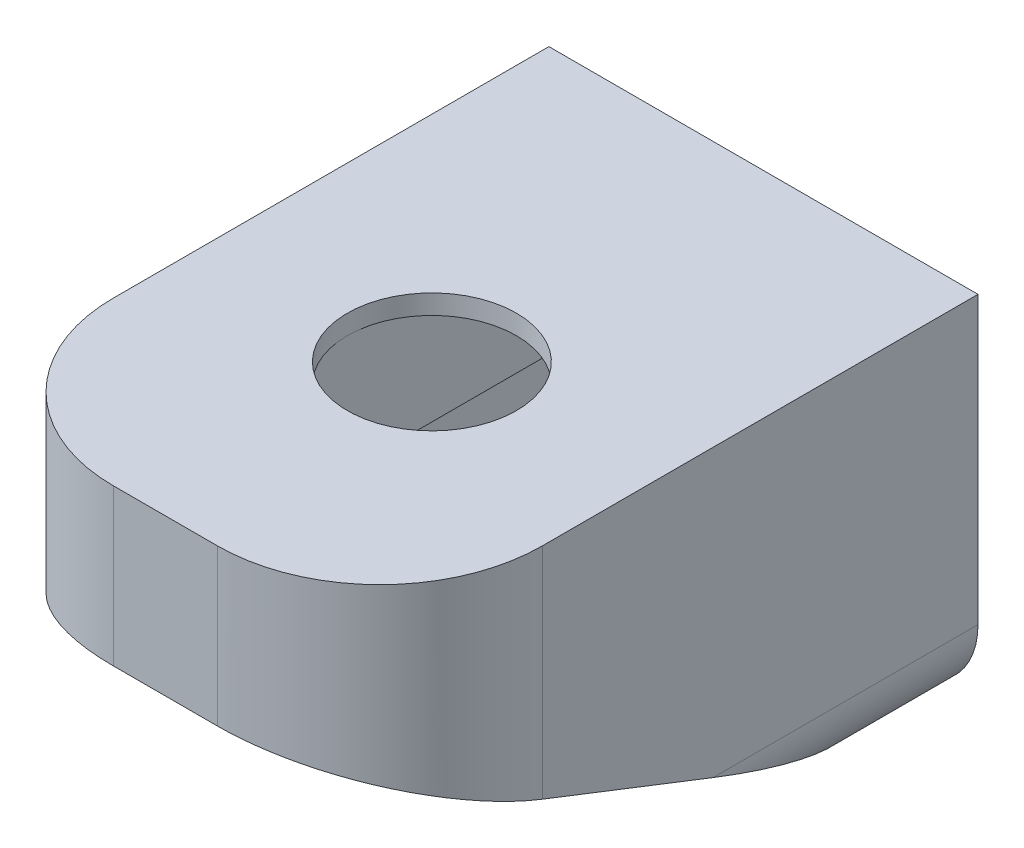
ISO-10303-21;
HEADER;
FILE_DESCRIPTION(('STEP AP214'),'2;1');
FILE_NAME('part.step','',(''),(''),'','','');
FILE_SCHEMA(('AUTOMOTIVE_DESIGN { 1 0 10303 214 1 1 1 1 }'));
ENDSEC;
DATA;
#1=APPLICATION_CONTEXT('core data for automotive mechanical design processes');
#2=APPLICATION_PROTOCOL_DEFINITION('international standard','automotive_design',2000,#1);
#3=PRODUCT_CONTEXT('',#1,'mechanical');
#4=PRODUCT('Part','Part','',(#3));
#5=PRODUCT_RELATED_PRODUCT_CATEGORY('part','',(#4));
#6=PRODUCT_DEFINITION_FORMATION('','',#4);
#7=PRODUCT_DEFINITION_CONTEXT('part definition',#1,'design');
#8=PRODUCT_DEFINITION('design','',#6,#7);
#9=PRODUCT_DEFINITION_SHAPE('','',#8);
#10=(LENGTH_UNIT() NAMED_UNIT(*) SI_UNIT(.MILLI.,.METRE.));
#11=(NAMED_UNIT(*) PLANE_ANGLE_UNIT() SI_UNIT($,.RADIAN.));
#12=(NAMED_UNIT(*) SI_UNIT($,.STERADIAN.) SOLID_ANGLE_UNIT());
#13=UNCERTAINTY_MEASURE_WITH_UNIT(LENGTH_MEASURE(1.E-05),#10,'distance_accuracy_value','');
#14=(GEOMETRIC_REPRESENTATION_CONTEXT(3) GLOBAL_UNCERTAINTY_ASSIGNED_CONTEXT((#13)) GLOBAL_UNIT_ASSIGNED_CONTEXT((#10,
#11,#12)) REPRESENTATION_CONTEXT('',''));
#15=CARTESIAN_POINT('',(0.,0.,0.));
#16=DIRECTION('',(0.,0.,1.));
#17=DIRECTION('',(1.,0.,0.));
#18=AXIS2_PLACEMENT_3D('',#15,#16,#17);
#19=CARTESIAN_POINT('',(0.,12.5,0.));
#20=DIRECTION('',(0.,-1.,0.));
#21=DIRECTION('',(0.,0.,-1.));
#22=AXIS2_PLACEMENT_3D('',#19,#20,#21);
#23=PLANE('',#22);
#24=CARTESIAN_POINT('',(0.,12.5,25.5));
#25=DIRECTION('',(0.,-1.,0.));
#26=DIRECTION('',(0.,0.,-1.));
#27=AXIS2_PLACEMENT_3D('',#24,#25,#26);
#28=CIRCLE('',#27,6.5);
#29=CARTESIAN_POINT('',(6.5,12.5,25.5));
#30=VERTEX_POINT('',#29);
#31=CARTESIAN_POINT('',(0.,12.5,32.));
#32=VERTEX_POINT('',#31);
#33=EDGE_CURVE('E189',#30,#32,#28,.T.);
#34=ORIENTED_EDGE('',*,*,#33,.F.);
#35=DIRECTION('',(0.,0.,1.));
#36=VECTOR('',#35,1.);
#37=CARTESIAN_POINT('',(6.5,12.5,32.));
#38=LINE('',#37,#36);
#39=CARTESIAN_POINT('',(6.5,12.5,32.));
#40=VERTEX_POINT('',#39);
#41=EDGE_CURVE('E198',#30,#40,#38,.T.);
#42=ORIENTED_EDGE('',*,*,#41,.T.);
#43=DIRECTION('',(-1.,0.,0.));
#44=VECTOR('',#43,1.);
#45=CARTESIAN_POINT('',(-6.5,12.5,32.));
#46=LINE('',#45,#44);
#47=EDGE_CURVE('E201',#40,#32,#46,.T.);
#48=ORIENTED_EDGE('',*,*,#47,.T.);
#49=EDGE_LOOP('',(#34,#42,#48));
#50=FACE_BOUND('',#49,.T.);
#51=ADVANCED_FACE('F40',(#50),#23,.T.);
#52=CARTESIAN_POINT('',(-6.5,12.5,25.5));
#53=VERTEX_POINT('',#52);
#54=EDGE_CURVE('E57',#32,#53,#28,.T.);
#55=ORIENTED_EDGE('',*,*,#54,.F.);
#56=CARTESIAN_POINT('',(-6.5,12.5,32.));
#57=VERTEX_POINT('',#56);
#58=EDGE_CURVE('E215',#32,#57,#46,.T.);
#59=ORIENTED_EDGE('',*,*,#58,.T.);
#60=DIRECTION('',(0.,0.,-1.));
#61=VECTOR('',#60,1.);
#62=CARTESIAN_POINT('',(-6.5,12.5,32.));
#63=LINE('',#62,#61);
#64=EDGE_CURVE('E220',#57,#53,#63,.T.);
#65=ORIENTED_EDGE('',*,*,#64,.T.);
#66=EDGE_LOOP('',(#55,#59,#65));
#67=FACE_BOUND('',#66,.T.);
#68=ADVANCED_FACE('F483',(#67),#23,.T.);
#69=CARTESIAN_POINT('',(-13.5,3.49999999999999,2.5));
#70=DIRECTION('',(0.,1.,0.));
#71=DIRECTION('',(0.,0.,1.));
#72=AXIS2_PLACEMENT_3D('',#69,#70,#71);
#73=PLANE('',#72);
#74=CARTESIAN_POINT('',(0.,3.49999999999999,34.3));
#75=DIRECTION('',(0.,-1.,0.));
#76=DIRECTION('',(0.,0.,-1.));
#77=AXIS2_PLACEMENT_3D('',#74,#75,#76);
#78=CIRCLE('',#77,1.);
#79=CARTESIAN_POINT('',(0.,3.49999999999999,33.3));
#80=VERTEX_POINT('',#79);
#81=EDGE_CURVE('E372',#80,#80,#78,.T.);
#82=ORIENTED_EDGE('',*,*,#81,.F.);
#83=EDGE_LOOP('',(#82));
#84=FACE_BOUND('',#83,.T.);
#85=CARTESIAN_POINT('',(0.,3.49999999999999,6.7));
#86=DIRECTION('',(0.,-1.,0.));
#87=DIRECTION('',(0.,0.,-1.));
#88=AXIS2_PLACEMENT_3D('',#85,#86,#87);
#89=CIRCLE('',#88,1.);
#90=CARTESIAN_POINT('',(0.,3.49999999999999,5.7));
#91=VERTEX_POINT('',#90);
#92=EDGE_CURVE('E368',#91,#91,#89,.T.);
#93=ORIENTED_EDGE('',*,*,#92,.F.);
#94=EDGE_LOOP('',(#93));
#95=FACE_BOUND('',#94,.T.);
#96=DIRECTION('',(1.,0.,0.));
#97=VECTOR('',#96,1.);
#98=CARTESIAN_POINT('',(-13.5,3.49999999999999,40.5));
#99=LINE('',#98,#97);
#100=CARTESIAN_POINT('',(-0.999999999999997,3.49999999999999,40.5));
#101=VERTEX_POINT('',#100);
#102=CARTESIAN_POINT('',(1.,3.49999999999999,40.5));
#103=VERTEX_POINT('',#102);
#104=EDGE_CURVE('E260',#101,#103,#99,.T.);
#105=ORIENTED_EDGE('',*,*,#104,.F.);
#106=CARTESIAN_POINT('',(-0.999999999999997,3.49999999999999,28.));
#107=DIRECTION('',(0.,1.,0.));
#108=DIRECTION('',(0.,0.,1.));
#109=AXIS2_PLACEMENT_3D('',#106,#107,#108);
#110=CIRCLE('',#109,12.5);
#111=CARTESIAN_POINT('',(-13.5,3.49999999999999,28.));
#112=VERTEX_POINT('',#111);
#113=EDGE_CURVE('E305',#101,#112,#110,.F.);
#114=ORIENTED_EDGE('',*,*,#113,.T.);
#115=DIRECTION('',(0.,0.,1.));
#116=VECTOR('',#115,1.);
#117=CARTESIAN_POINT('',(-13.5,3.49999999999999,2.5));
#118=LINE('',#117,#116);
#119=CARTESIAN_POINT('',(-13.5,3.49999999999999,2.5));
#120=VERTEX_POINT('',#119);
#121=EDGE_CURVE('E246',#120,#112,#118,.T.);
#122=ORIENTED_EDGE('',*,*,#121,.F.);
#123=DIRECTION('',(1.,0.,0.));
#124=VECTOR('',#123,1.);
#125=CARTESIAN_POINT('',(-13.5,3.49999999999999,2.5));
#126=LINE('',#125,#124);
#127=CARTESIAN_POINT('',(13.5,3.49999999999999,2.5));
#128=VERTEX_POINT('',#127);
#129=EDGE_CURVE('E263',#120,#128,#126,.T.);
#130=ORIENTED_EDGE('',*,*,#129,.T.);
#131=DIRECTION('',(0.,0.,1.));
#132=VECTOR('',#131,1.);
#133=CARTESIAN_POINT('',(13.5,3.49999999999999,2.5));
#134=LINE('',#133,#132);
#135=CARTESIAN_POINT('',(13.5,3.49999999999999,28.));
#136=VERTEX_POINT('',#135);
#137=EDGE_CURVE('E244',#128,#136,#134,.T.);
#138=ORIENTED_EDGE('',*,*,#137,.T.);
#139=CARTESIAN_POINT('',(1.,3.49999999999999,28.));
#140=DIRECTION('',(0.,1.,0.));
#141=DIRECTION('',(0.,0.,1.));
#142=AXIS2_PLACEMENT_3D('',#139,#140,#141);
#143=CIRCLE('',#142,12.5);
#144=EDGE_CURVE('E303',#136,#103,#143,.F.);
#145=ORIENTED_EDGE('',*,*,#144,.T.);
#146=EDGE_LOOP('',(#105,#114,#122,#130,#138,#145));
#147=FACE_BOUND('',#146,.T.);
#148=DIRECTION('',(0.,0.,1.));
#149=VECTOR('',#148,1.);
#150=CARTESIAN_POINT('',(6.5,3.49999999999999,32.));
#151=LINE('',#150,#149);
#152=CARTESIAN_POINT('',(6.50000000000001,3.49999999999999,9.));
#153=VERTEX_POINT('',#152);
#154=CARTESIAN_POINT('',(6.5,3.49999999999999,32.));
#155=VERTEX_POINT('',#154);
#156=EDGE_CURVE('E224',#153,#155,#151,.T.);
#157=ORIENTED_EDGE('',*,*,#156,.F.);
#158=DIRECTION('',(1.,0.,0.));
#159=VECTOR('',#158,1.);
#160=CARTESIAN_POINT('',(-6.49999999999999,3.49999999999999,9.));
#161=LINE('',#160,#159);
#162=CARTESIAN_POINT('',(-6.49999999999999,3.49999999999999,9.));
#163=VERTEX_POINT('',#162);
#164=EDGE_CURVE('E210',#163,#153,#161,.T.);
#165=ORIENTED_EDGE('',*,*,#164,.F.);
#166=DIRECTION('',(0.,0.,-1.));
#167=VECTOR('',#166,1.);
#168=CARTESIAN_POINT('',(-6.5,3.49999999999999,32.));
#169=LINE('',#168,#167);
#170=CARTESIAN_POINT('',(-6.5,3.49999999999999,32.));
#171=VERTEX_POINT('',#170);
#172=EDGE_CURVE('E65',#171,#163,#169,.T.);
#173=ORIENTED_EDGE('',*,*,#172,.F.);
#174=DIRECTION('',(-1.,0.,0.));
#175=VECTOR('',#174,1.);
#176=CARTESIAN_POINT('',(-6.5,3.49999999999999,32.));
#177=LINE('',#176,#175);
#178=EDGE_CURVE('E226',#155,#171,#177,.T.);
#179=ORIENTED_EDGE('',*,*,#178,.F.);
#180=EDGE_LOOP('',(#157,#165,#173,#179));
#181=FACE_BOUND('',#180,.T.);
#182=ADVANCED_FACE('F426',(#84,#95,#147,#181),#73,.F.);
#183=CARTESIAN_POINT('',(-16.5,-14.,46.));
#184=DIRECTION('',(0.,1.,0.));
#185=DIRECTION('',(0.,0.,1.));
#186=AXIS2_PLACEMENT_3D('',#183,#184,#185);
#187=PLANE('',#186);
#188=DIRECTION('',(1.,0.,0.));
#189=VECTOR('',#188,1.);
#190=CARTESIAN_POINT('',(-13.5,-14.,2.5));
#191=LINE('',#190,#189);
#192=CARTESIAN_POINT('',(-10.5,-14.,2.5));
#193=VERTEX_POINT('',#192);
#194=CARTESIAN_POINT('',(10.5,-14.,2.5));
#195=VERTEX_POINT('',#194);
#196=EDGE_CURVE('E249',#193,#195,#191,.T.);
#197=ORIENTED_EDGE('',*,*,#196,.F.);
#198=DIRECTION('',(0.,0.,-1.));
#199=VECTOR('',#198,1.);
#200=CARTESIAN_POINT('',(-10.5,-14.,46.));
#201=LINE('',#200,#199);
#202=CARTESIAN_POINT('',(-10.5,-14.,0.));
#203=VERTEX_POINT('',#202);
#204=EDGE_CURVE('E333',#193,#203,#201,.T.);
#205=ORIENTED_EDGE('',*,*,#204,.T.);
#206=DIRECTION('',(1.,0.,0.));
#207=VECTOR('',#206,1.);
#208=CARTESIAN_POINT('',(-16.5,-14.,0.));
#209=LINE('',#208,#207);
#210=CARTESIAN_POINT('',(10.5,-14.,0.));
#211=VERTEX_POINT('',#210);
#212=EDGE_CURVE('E281',#203,#211,#209,.T.);
#213=ORIENTED_EDGE('',*,*,#212,.T.);
#214=DIRECTION('',(0.,0.,-1.));
#215=VECTOR('',#214,1.);
#216=CARTESIAN_POINT('',(10.5,-14.,46.));
#217=LINE('',#216,#215);
#218=EDGE_CURVE('E331',#211,#195,#217,.F.);
#219=ORIENTED_EDGE('',*,*,#218,.T.);
#220=EDGE_LOOP('',(#197,#205,#213,#219));
#221=FACE_BOUND('',#220,.T.);
#222=ADVANCED_FACE('F406',(#221),#187,.F.);
#223=CARTESIAN_POINT('',(-16.5,-13.8430562725865,5.40216830149716));
#224=DIRECTION('',(0.,-0.93157761948506,0.363542485652706));
#225=DIRECTION('',(0.,-0.363542485652707,-0.93157761948506));
#226=AXIS2_PLACEMENT_3D('',#223,#224,#225);
#227=PLANE('',#226);
#228=DIRECTION('',(0.,-0.363542485652707,-0.93157761948506));
#229=VECTOR('',#228,1.);
#230=CARTESIAN_POINT('',(-16.5,-13.8430562725865,5.40216830149716));
#231=LINE('',#230,#229);
#232=CARTESIAN_POINT('',(-16.5,-2.87804878048781,33.5));
#233=VERTEX_POINT('',#232);
#234=CARTESIAN_POINT('',(-16.5,-8.,20.375));
#235=VERTEX_POINT('',#234);
#236=EDGE_CURVE('E268',#233,#235,#231,.T.);
#237=ORIENTED_EDGE('',*,*,#236,.T.);
#238=CARTESIAN_POINT('',(-10.5,-8.00000000000001,20.375));
#239=DIRECTION('',(0.,-0.93157761948506,0.363542485652706));
#240=DIRECTION('',(0.,-0.363542485652707,-0.93157761948506));
#241=AXIS2_PLACEMENT_3D('',#238,#239,#240);
#242=ELLIPSE('',#241,16.504260813499,6.);
#243=CARTESIAN_POINT('',(-13.5,-13.1961524227066,7.05985941681425));
#244=VERTEX_POINT('',#243);
#245=EDGE_CURVE('E344',#235,#244,#242,.T.);
#246=ORIENTED_EDGE('',*,*,#245,.T.);
#247=DIRECTION('',(0.,-0.363542485652707,-0.93157761948506));
#248=VECTOR('',#247,1.);
#249=CARTESIAN_POINT('',(-13.5,-0.146341463414639,40.5));
#250=LINE('',#249,#248);
#251=CARTESIAN_POINT('',(-13.5,-5.02439024390245,28.));
#252=VERTEX_POINT('',#251);
#253=EDGE_CURVE('E240',#252,#244,#250,.T.);
#254=ORIENTED_EDGE('',*,*,#253,.F.);
#255=CARTESIAN_POINT('',(-0.999999999999997,-5.02439024390245,28.));
#256=DIRECTION('',(0.,-0.93157761948506,0.363542485652706));
#257=DIRECTION('',(0.,-0.363542485652707,-0.93157761948506));
#258=AXIS2_PLACEMENT_3D('',#255,#256,#257);
#259=ELLIPSE('',#258,13.4180982223569,12.5);
#260=CARTESIAN_POINT('',(-0.999999999999997,-0.146341463414639,40.5));
#261=VERTEX_POINT('',#260);
#262=EDGE_CURVE('E309',#252,#261,#259,.F.);
#263=ORIENTED_EDGE('',*,*,#262,.T.);
#264=DIRECTION('',(1.,0.,0.));
#265=VECTOR('',#264,1.);
#266=CARTESIAN_POINT('',(-13.5,-0.146341463414639,40.5));
#267=LINE('',#266,#265);
#268=CARTESIAN_POINT('',(1.,-0.146341463414639,40.5));
#269=VERTEX_POINT('',#268);
#270=EDGE_CURVE('E256',#261,#269,#267,.T.);
#271=ORIENTED_EDGE('',*,*,#270,.T.);
#272=CARTESIAN_POINT('',(1.,-5.02439024390244,28.));
#273=DIRECTION('',(0.,-0.93157761948506,0.363542485652706));
#274=DIRECTION('',(0.,0.363542485652707,0.93157761948506));
#275=AXIS2_PLACEMENT_3D('',#272,#273,#274);
#276=ELLIPSE('',#275,13.4180982223569,12.5);
#277=CARTESIAN_POINT('',(13.5,-5.02439024390245,28.));
#278=VERTEX_POINT('',#277);
#279=EDGE_CURVE('E311',#269,#278,#276,.F.);
#280=ORIENTED_EDGE('',*,*,#279,.T.);
#281=DIRECTION('',(0.,-0.363542485652707,-0.93157761948506));
#282=VECTOR('',#281,1.);
#283=CARTESIAN_POINT('',(13.5,-0.146341463414639,40.5));
#284=LINE('',#283,#282);
#285=CARTESIAN_POINT('',(13.5,-13.1961524227066,7.05985941681425));
#286=VERTEX_POINT('',#285);
#287=EDGE_CURVE('E234',#278,#286,#284,.T.);
#288=ORIENTED_EDGE('',*,*,#287,.T.);
#289=CARTESIAN_POINT('',(10.5,-8.00000000000001,20.375));
#290=DIRECTION('',(0.,-0.93157761948506,0.363542485652706));
#291=DIRECTION('',(0.,-0.363542485652707,-0.93157761948506));
#292=AXIS2_PLACEMENT_3D('',#289,#290,#291);
#293=ELLIPSE('',#292,16.504260813499,6.);
#294=CARTESIAN_POINT('',(16.5,-8.00000000000001,20.375));
#295=VERTEX_POINT('',#294);
#296=EDGE_CURVE('E342',#286,#295,#293,.T.);
#297=ORIENTED_EDGE('',*,*,#296,.T.);
#298=DIRECTION('',(0.,-0.363542485652707,-0.93157761948506));
#299=VECTOR('',#298,1.);
#300=CARTESIAN_POINT('',(16.5,-13.8430562725865,5.40216830149716));
#301=LINE('',#300,#299);
#302=CARTESIAN_POINT('',(16.5,-2.87804878048781,33.5));
#303=VERTEX_POINT('',#302);
#304=EDGE_CURVE('E259',#303,#295,#301,.T.);
#305=ORIENTED_EDGE('',*,*,#304,.F.);
#306=CARTESIAN_POINT('',(4.,-2.87804878048781,33.5));
#307=DIRECTION('',(0.,-0.93157761948506,0.363542485652706));
#308=DIRECTION('',(0.,-0.363542485652707,-0.93157761948506));
#309=AXIS2_PLACEMENT_3D('',#306,#307,#308);
#310=ELLIPSE('',#309,13.4180982223569,12.5);
#311=CARTESIAN_POINT('',(4.,2.,46.));
#312=VERTEX_POINT('',#311);
#313=EDGE_CURVE('E327',#303,#312,#310,.T.);
#314=ORIENTED_EDGE('',*,*,#313,.T.);
#315=DIRECTION('',(1.,0.,0.));
#316=VECTOR('',#315,1.);
#317=CARTESIAN_POINT('',(-16.5,2.,46.));
#318=LINE('',#317,#316);
#319=CARTESIAN_POINT('',(-4.,2.,46.));
#320=VERTEX_POINT('',#319);
#321=EDGE_CURVE('E271',#320,#312,#318,.T.);
#322=ORIENTED_EDGE('',*,*,#321,.F.);
#323=CARTESIAN_POINT('',(-4.,-2.87804878048781,33.5));
#324=DIRECTION('',(0.,-0.93157761948506,0.363542485652706));
#325=DIRECTION('',(0.,0.363542485652707,0.93157761948506));
#326=AXIS2_PLACEMENT_3D('',#323,#324,#325);
#327=ELLIPSE('',#326,13.4180982223569,12.5);
#328=EDGE_CURVE('E325',#320,#233,#327,.T.);
#329=ORIENTED_EDGE('',*,*,#328,.T.);
#330=EDGE_LOOP('',(#237,#246,#254,#263,#271,#280,#288,#297,#305,#314,#322,#329));
#331=FACE_BOUND('',#330,.T.);
#332=ADVANCED_FACE('F436',(#331),#227,.T.);
#333=CARTESIAN_POINT('',(16.5,14.,46.));
#334=DIRECTION('',(-1.,0.,0.));
#335=DIRECTION('',(0.,0.,1.));
#336=AXIS2_PLACEMENT_3D('',#333,#334,#335);
#337=PLANE('',#336);
#338=ORIENTED_EDGE('',*,*,#304,.T.);
#339=DIRECTION('',(0.,0.,-1.));
#340=VECTOR('',#339,1.);
#341=CARTESIAN_POINT('',(16.5,-8.00000000000001,46.));
#342=LINE('',#341,#340);
#343=CARTESIAN_POINT('',(16.5,-8.00000000000001,0.));
#344=VERTEX_POINT('',#343);
#345=EDGE_CURVE('E49',#295,#344,#342,.T.);
#346=ORIENTED_EDGE('',*,*,#345,.T.);
#347=DIRECTION('',(0.,1.,0.));
#348=VECTOR('',#347,1.);
#349=CARTESIAN_POINT('',(16.5,14.,0.));
#350=LINE('',#349,#348);
#351=CARTESIAN_POINT('',(16.5,14.,0.));
#352=VERTEX_POINT('',#351);
#353=EDGE_CURVE('E276',#344,#352,#350,.T.);
#354=ORIENTED_EDGE('',*,*,#353,.T.);
#355=DIRECTION('',(0.,0.,-1.));
#356=VECTOR('',#355,1.);
#357=CARTESIAN_POINT('',(16.5,14.,46.));
#358=LINE('',#357,#356);
#359=CARTESIAN_POINT('',(16.5,14.,33.5));
#360=VERTEX_POINT('',#359);
#361=EDGE_CURVE('E292',#360,#352,#358,.T.);
#362=ORIENTED_EDGE('',*,*,#361,.F.);
#363=DIRECTION('',(0.,1.,0.));
#364=VECTOR('',#363,1.);
#365=CARTESIAN_POINT('',(16.5,2.,33.5));
#366=LINE('',#365,#364);
#367=EDGE_CURVE('E323',#360,#303,#366,.F.);
#368=ORIENTED_EDGE('',*,*,#367,.T.);
#369=EDGE_LOOP('',(#338,#346,#354,#362,#368));
#370=FACE_BOUND('',#369,.T.);
#371=ADVANCED_FACE('F468',(#370),#337,.F.);
#372=CARTESIAN_POINT('',(-16.5,14.,46.));
#373=DIRECTION('',(1.,0.,0.));
#374=DIRECTION('',(0.,0.,-1.));
#375=AXIS2_PLACEMENT_3D('',#372,#373,#374);
#376=PLANE('',#375);
#377=DIRECTION('',(0.,-1.,0.));
#378=VECTOR('',#377,1.);
#379=CARTESIAN_POINT('',(-16.5,14.,0.));
#380=LINE('',#379,#378);
#381=CARTESIAN_POINT('',(-16.5,14.,0.));
#382=VERTEX_POINT('',#381);
#383=CARTESIAN_POINT('',(-16.5,-8.00000000000001,0.));
#384=VERTEX_POINT('',#383);
#385=EDGE_CURVE('E286',#382,#384,#380,.T.);
#386=ORIENTED_EDGE('',*,*,#385,.T.);
#387=DIRECTION('',(0.,0.,-1.));
#388=VECTOR('',#387,1.);
#389=CARTESIAN_POINT('',(-16.5,-8.00000000000001,46.));
#390=LINE('',#389,#388);
#391=EDGE_CURVE('E340',#384,#235,#390,.F.);
#392=ORIENTED_EDGE('',*,*,#391,.T.);
#393=ORIENTED_EDGE('',*,*,#236,.F.);
#394=DIRECTION('',(0.,-1.,0.));
#395=VECTOR('',#394,1.);
#396=CARTESIAN_POINT('',(-16.5,14.,33.5));
#397=LINE('',#396,#395);
#398=CARTESIAN_POINT('',(-16.5,14.,33.5));
#399=VERTEX_POINT('',#398);
#400=EDGE_CURVE('E329',#233,#399,#397,.F.);
#401=ORIENTED_EDGE('',*,*,#400,.T.);
#402=DIRECTION('',(0.,0.,-1.));
#403=VECTOR('',#402,1.);
#404=CARTESIAN_POINT('',(-16.5,14.,46.));
#405=LINE('',#404,#403);
#406=EDGE_CURVE('E280',#399,#382,#405,.T.);
#407=ORIENTED_EDGE('',*,*,#406,.T.);
#408=EDGE_LOOP('',(#386,#392,#393,#401,#407));
#409=FACE_BOUND('',#408,.T.);
#410=ADVANCED_FACE('F452',(#409),#376,.F.);
#411=CARTESIAN_POINT('',(0.,0.,46.));
#412=DIRECTION('',(0.,0.,1.));
#413=DIRECTION('',(1.,0.,0.));
#414=AXIS2_PLACEMENT_3D('',#411,#412,#413);
#415=PLANE('',#414);
#416=ORIENTED_EDGE('',*,*,#321,.T.);
#417=DIRECTION('',(0.,1.,0.));
#418=VECTOR('',#417,1.);
#419=CARTESIAN_POINT('',(4.,14.,46.));
#420=LINE('',#419,#418);
#421=CARTESIAN_POINT('',(4.,14.,46.));
#422=VERTEX_POINT('',#421);
#423=EDGE_CURVE('E316',#312,#422,#420,.T.);
#424=ORIENTED_EDGE('',*,*,#423,.T.);
#425=DIRECTION('',(-1.,0.,0.));
#426=VECTOR('',#425,1.);
#427=CARTESIAN_POINT('',(-16.5,14.,46.));
#428=LINE('',#427,#426);
#429=CARTESIAN_POINT('',(-4.,14.,46.));
#430=VERTEX_POINT('',#429);
#431=EDGE_CURVE('E277',#422,#430,#428,.T.);
#432=ORIENTED_EDGE('',*,*,#431,.T.);
#433=DIRECTION('',(0.,-1.,0.));
#434=VECTOR('',#433,1.);
#435=CARTESIAN_POINT('',(-4.,2.,46.));
#436=LINE('',#435,#434);
#437=EDGE_CURVE('E313',#430,#320,#436,.T.);
#438=ORIENTED_EDGE('',*,*,#437,.T.);
#439=EDGE_LOOP('',(#416,#424,#432,#438));
#440=FACE_BOUND('',#439,.T.);
#441=ADVANCED_FACE('F460',(#440),#415,.T.);
#442=CARTESIAN_POINT('',(-16.5,14.,46.));
#443=DIRECTION('',(0.,-1.,0.));
#444=DIRECTION('',(0.,0.,-1.));
#445=AXIS2_PLACEMENT_3D('',#442,#443,#444);
#446=PLANE('',#445);
#447=CARTESIAN_POINT('',(0.,14.,25.5));
#448=DIRECTION('',(0.,-1.,0.));
#449=DIRECTION('',(0.,0.,-1.));
#450=AXIS2_PLACEMENT_3D('',#447,#448,#449);
#451=CIRCLE('',#450,6.5);
#452=CARTESIAN_POINT('',(0.,14.,19.));
#453=VERTEX_POINT('',#452);
#454=EDGE_CURVE('E202',#453,#453,#451,.T.);
#455=ORIENTED_EDGE('',*,*,#454,.T.);
#456=EDGE_LOOP('',(#455));
#457=FACE_BOUND('',#456,.T.);
#458=ORIENTED_EDGE('',*,*,#431,.F.);
#459=CARTESIAN_POINT('',(4.,14.,33.5));
#460=DIRECTION('',(0.,-1.,0.));
#461=DIRECTION('',(0.,0.,-1.));
#462=AXIS2_PLACEMENT_3D('',#459,#460,#461);
#463=CIRCLE('',#462,12.5);
#464=EDGE_CURVE('E321',#422,#360,#463,.F.);
#465=ORIENTED_EDGE('',*,*,#464,.T.);
#466=ORIENTED_EDGE('',*,*,#361,.T.);
#467=DIRECTION('',(-1.,0.,0.));
#468=VECTOR('',#467,1.);
#469=CARTESIAN_POINT('',(-16.5,14.,0.));
#470=LINE('',#469,#468);
#471=EDGE_CURVE('E283',#352,#382,#470,.T.);
#472=ORIENTED_EDGE('',*,*,#471,.T.);
#473=ORIENTED_EDGE('',*,*,#406,.F.);
#474=CARTESIAN_POINT('',(-4.,14.,33.5));
#475=DIRECTION('',(0.,-1.,0.));
#476=DIRECTION('',(0.,0.,-1.));
#477=AXIS2_PLACEMENT_3D('',#474,#475,#476);
#478=CIRCLE('',#477,12.5);
#479=EDGE_CURVE('E319',#399,#430,#478,.F.);
#480=ORIENTED_EDGE('',*,*,#479,.T.);
#481=EDGE_LOOP('',(#458,#465,#466,#472,#473,#480));
#482=FACE_BOUND('',#481,.T.);
#483=ADVANCED_FACE('F395',(#457,#482),#446,.F.);
#484=CARTESIAN_POINT('',(0.,0.,0.));
#485=DIRECTION('',(0.,0.,1.));
#486=DIRECTION('',(1.,0.,0.));
#487=AXIS2_PLACEMENT_3D('',#484,#485,#486);
#488=PLANE('',#487);
#489=CARTESIAN_POINT('',(9.5,0.,0.));
#490=DIRECTION('',(0.,0.,-1.));
#491=DIRECTION('',(-1.,0.,0.));
#492=AXIS2_PLACEMENT_3D('',#489,#490,#491);
#493=CIRCLE('',#492,1.3);
#494=CARTESIAN_POINT('',(8.2,0.,0.));
#495=VERTEX_POINT('',#494);
#496=EDGE_CURVE('E382',#495,#495,#493,.T.);
#497=ORIENTED_EDGE('',*,*,#496,.F.);
#498=EDGE_LOOP('',(#497));
#499=FACE_BOUND('',#498,.T.);
#500=CARTESIAN_POINT('',(0.500000000000002,0.,0.));
#501=DIRECTION('',(0.,0.,-1.));
#502=DIRECTION('',(-1.,0.,0.));
#503=AXIS2_PLACEMENT_3D('',#500,#501,#502);
#504=CIRCLE('',#503,1.3);
#505=CARTESIAN_POINT('',(-0.799999999999998,0.,0.));
#506=VERTEX_POINT('',#505);
#507=EDGE_CURVE('E381',#506,#506,#504,.T.);
#508=ORIENTED_EDGE('',*,*,#507,.F.);
#509=EDGE_LOOP('',(#508));
#510=FACE_BOUND('',#509,.T.);
#511=CARTESIAN_POINT('',(5.,0.,0.));
#512=DIRECTION('',(0.,0.,-1.));
#513=DIRECTION('',(-1.,0.,0.));
#514=AXIS2_PLACEMENT_3D('',#511,#512,#513);
#515=CIRCLE('',#514,2.5);
#516=CARTESIAN_POINT('',(2.5,0.,0.));
#517=VERTEX_POINT('',#516);
#518=EDGE_CURVE('E359',#517,#517,#515,.T.);
#519=ORIENTED_EDGE('',*,*,#518,.F.);
#520=EDGE_LOOP('',(#519));
#521=FACE_BOUND('',#520,.T.);
#522=ORIENTED_EDGE('',*,*,#212,.F.);
#523=CARTESIAN_POINT('',(-10.5,-8.00000000000001,0.));
#524=DIRECTION('',(0.,0.,1.));
#525=DIRECTION('',(1.,0.,0.));
#526=AXIS2_PLACEMENT_3D('',#523,#524,#525);
#527=CIRCLE('',#526,6.);
#528=EDGE_CURVE('E338',#203,#384,#527,.F.);
#529=ORIENTED_EDGE('',*,*,#528,.T.);
#530=ORIENTED_EDGE('',*,*,#385,.F.);
#531=ORIENTED_EDGE('',*,*,#471,.F.);
#532=ORIENTED_EDGE('',*,*,#353,.F.);
#533=CARTESIAN_POINT('',(10.5,-8.00000000000001,0.));
#534=DIRECTION('',(0.,0.,1.));
#535=DIRECTION('',(1.,0.,0.));
#536=AXIS2_PLACEMENT_3D('',#533,#534,#535);
#537=CIRCLE('',#536,6.);
#538=EDGE_CURVE('E336',#344,#211,#537,.F.);
#539=ORIENTED_EDGE('',*,*,#538,.T.);
#540=EDGE_LOOP('',(#522,#529,#530,#531,#532,#539));
#541=FACE_BOUND('',#540,.T.);
#542=ADVANCED_FACE('F391',(#499,#510,#521,#541),#488,.F.);
#543=CARTESIAN_POINT('',(-13.5,3.49999999999999,40.5));
#544=DIRECTION('',(0.,0.,1.));
#545=DIRECTION('',(1.,0.,0.));
#546=AXIS2_PLACEMENT_3D('',#543,#544,#545);
#547=PLANE('',#546);
#548=ORIENTED_EDGE('',*,*,#270,.F.);
#549=DIRECTION('',(0.,-1.,0.));
#550=VECTOR('',#549,1.);
#551=CARTESIAN_POINT('',(-0.999999999999997,3.49999999999999,40.5));
#552=LINE('',#551,#550);
#553=EDGE_CURVE('E301',#261,#101,#552,.F.);
#554=ORIENTED_EDGE('',*,*,#553,.T.);
#555=ORIENTED_EDGE('',*,*,#104,.T.);
#556=DIRECTION('',(0.,-1.,0.));
#557=VECTOR('',#556,1.);
#558=CARTESIAN_POINT('',(1.,-0.146341463414639,40.5));
#559=LINE('',#558,#557);
#560=EDGE_CURVE('E298',#103,#269,#559,.T.);
#561=ORIENTED_EDGE('',*,*,#560,.T.);
#562=EDGE_LOOP('',(#548,#554,#555,#561));
#563=FACE_BOUND('',#562,.T.);
#564=ADVANCED_FACE('F394',(#563),#547,.F.);
#565=CARTESIAN_POINT('',(-13.5,-14.,2.5));
#566=DIRECTION('',(0.,0.,-1.));
#567=DIRECTION('',(-1.,0.,0.));
#568=AXIS2_PLACEMENT_3D('',#565,#566,#567);
#569=PLANE('',#568);
#570=CARTESIAN_POINT('',(9.5,0.,2.5));
#571=DIRECTION('',(0.,0.,-1.));
#572=DIRECTION('',(-1.,0.,0.));
#573=AXIS2_PLACEMENT_3D('',#570,#571,#572);
#574=CIRCLE('',#573,1.3);
#575=CARTESIAN_POINT('',(8.2,0.,2.5));
#576=VERTEX_POINT('',#575);
#577=EDGE_CURVE('E44',#576,#576,#574,.T.);
#578=ORIENTED_EDGE('',*,*,#577,.T.);
#579=EDGE_LOOP('',(#578));
#580=FACE_BOUND('',#579,.T.);
#581=CARTESIAN_POINT('',(0.500000000000002,0.,2.5));
#582=DIRECTION('',(0.,0.,-1.));
#583=DIRECTION('',(-1.,0.,0.));
#584=AXIS2_PLACEMENT_3D('',#581,#582,#583);
#585=CIRCLE('',#584,1.3);
#586=CARTESIAN_POINT('',(-0.799999999999998,0.,2.5));
#587=VERTEX_POINT('',#586);
#588=EDGE_CURVE('E358',#587,#587,#585,.T.);
#589=ORIENTED_EDGE('',*,*,#588,.T.);
#590=EDGE_LOOP('',(#589));
#591=FACE_BOUND('',#590,.T.);
#592=CARTESIAN_POINT('',(5.,0.,2.5));
#593=DIRECTION('',(0.,0.,-1.));
#594=DIRECTION('',(-1.,0.,0.));
#595=AXIS2_PLACEMENT_3D('',#592,#593,#594);
#596=CIRCLE('',#595,2.5);
#597=CARTESIAN_POINT('',(2.5,0.,2.5));
#598=VERTEX_POINT('',#597);
#599=EDGE_CURVE('E356',#598,#598,#596,.T.);
#600=ORIENTED_EDGE('',*,*,#599,.T.);
#601=EDGE_LOOP('',(#600));
#602=FACE_BOUND('',#601,.T.);
#603=DIRECTION('',(0.,1.,0.));
#604=VECTOR('',#603,1.);
#605=CARTESIAN_POINT('',(-13.5,-14.,2.5));
#606=LINE('',#605,#604);
#607=CARTESIAN_POINT('',(-13.5,-13.1961524227066,2.5));
#608=VERTEX_POINT('',#607);
#609=EDGE_CURVE('E243',#608,#120,#606,.T.);
#610=ORIENTED_EDGE('',*,*,#609,.F.);
#611=CARTESIAN_POINT('',(-10.5,-8.00000000000001,2.5));
#612=DIRECTION('',(0.,0.,-1.));
#613=DIRECTION('',(-1.,0.,0.));
#614=AXIS2_PLACEMENT_3D('',#611,#612,#613);
#615=CIRCLE('',#614,6.);
#616=EDGE_CURVE('E350',#608,#193,#615,.F.);
#617=ORIENTED_EDGE('',*,*,#616,.T.);
#618=ORIENTED_EDGE('',*,*,#196,.T.);
#619=CARTESIAN_POINT('',(10.5,-8.00000000000001,2.5));
#620=DIRECTION('',(0.,0.,-1.));
#621=DIRECTION('',(-1.,0.,0.));
#622=AXIS2_PLACEMENT_3D('',#619,#620,#621);
#623=CIRCLE('',#622,6.);
#624=CARTESIAN_POINT('',(13.5,-13.1961524227066,2.5));
#625=VERTEX_POINT('',#624);
#626=EDGE_CURVE('E348',#195,#625,#623,.F.);
#627=ORIENTED_EDGE('',*,*,#626,.T.);
#628=DIRECTION('',(0.,1.,0.));
#629=VECTOR('',#628,1.);
#630=CARTESIAN_POINT('',(13.5,-14.,2.5));
#631=LINE('',#630,#629);
#632=EDGE_CURVE('E252',#625,#128,#631,.T.);
#633=ORIENTED_EDGE('',*,*,#632,.T.);
#634=ORIENTED_EDGE('',*,*,#129,.F.);
#635=EDGE_LOOP('',(#610,#617,#618,#627,#633,#634));
#636=FACE_BOUND('',#635,.T.);
#637=ADVANCED_FACE('F416',(#580,#591,#602,#636),#569,.F.);
#638=CARTESIAN_POINT('',(-13.5,0.,0.));
#639=DIRECTION('',(1.,0.,0.));
#640=DIRECTION('',(0.,0.,-1.));
#641=AXIS2_PLACEMENT_3D('',#638,#639,#640);
#642=PLANE('',#641);
#643=ORIENTED_EDGE('',*,*,#253,.T.);
#644=DIRECTION('',(0.,0.,-1.));
#645=VECTOR('',#644,1.);
#646=CARTESIAN_POINT('',(-13.5,-13.1961524227066,7.05985941681425));
#647=LINE('',#646,#645);
#648=EDGE_CURVE('E346',#244,#608,#647,.T.);
#649=ORIENTED_EDGE('',*,*,#648,.T.);
#650=ORIENTED_EDGE('',*,*,#609,.T.);
#651=ORIENTED_EDGE('',*,*,#121,.T.);
#652=DIRECTION('',(0.,-1.,0.));
#653=VECTOR('',#652,1.);
#654=CARTESIAN_POINT('',(-13.5,0.,28.));
#655=LINE('',#654,#653);
#656=EDGE_CURVE('E295',#112,#252,#655,.T.);
#657=ORIENTED_EDGE('',*,*,#656,.T.);
#658=EDGE_LOOP('',(#643,#649,#650,#651,#657));
#659=FACE_BOUND('',#658,.T.);
#660=ADVANCED_FACE('F443',(#659),#642,.T.);
#661=CARTESIAN_POINT('',(13.5,0.,0.));
#662=DIRECTION('',(1.,0.,0.));
#663=DIRECTION('',(0.,0.,-1.));
#664=AXIS2_PLACEMENT_3D('',#661,#662,#663);
#665=PLANE('',#664);
#666=ORIENTED_EDGE('',*,*,#632,.F.);
#667=DIRECTION('',(0.,0.,-1.));
#668=VECTOR('',#667,1.);
#669=CARTESIAN_POINT('',(13.5,-13.1961524227066,2.5));
#670=LINE('',#669,#668);
#671=EDGE_CURVE('E12',#625,#286,#670,.F.);
#672=ORIENTED_EDGE('',*,*,#671,.T.);
#673=ORIENTED_EDGE('',*,*,#287,.F.);
#674=DIRECTION('',(0.,-1.,0.));
#675=VECTOR('',#674,1.);
#676=CARTESIAN_POINT('',(13.5,3.49999999999999,28.));
#677=LINE('',#676,#675);
#678=EDGE_CURVE('E307',#278,#136,#677,.F.);
#679=ORIENTED_EDGE('',*,*,#678,.T.);
#680=ORIENTED_EDGE('',*,*,#137,.F.);
#681=EDGE_LOOP('',(#666,#672,#673,#679,#680));
#682=FACE_BOUND('',#681,.T.);
#683=ADVANCED_FACE('F420',(#682),#665,.F.);
#684=CARTESIAN_POINT('',(-0.999999999999997,0.,28.));
#685=DIRECTION('',(0.,-1.,0.));
#686=DIRECTION('',(0.,0.,-1.));
#687=AXIS2_PLACEMENT_3D('',#684,#685,#686);
#688=CYLINDRICAL_SURFACE('',#687,12.5);
#689=ORIENTED_EDGE('',*,*,#113,.F.);
#690=ORIENTED_EDGE('',*,*,#553,.F.);
#691=ORIENTED_EDGE('',*,*,#262,.F.);
#692=ORIENTED_EDGE('',*,*,#656,.F.);
#693=EDGE_LOOP('',(#689,#690,#691,#692));
#694=FACE_BOUND('',#693,.T.);
#695=ADVANCED_FACE('F441',(#694),#688,.F.);
#696=CARTESIAN_POINT('',(1.,3.49999999999999,28.));
#697=DIRECTION('',(0.,1.,0.));
#698=DIRECTION('',(0.,0.,1.));
#699=AXIS2_PLACEMENT_3D('',#696,#697,#698);
#700=CYLINDRICAL_SURFACE('',#699,12.5);
#701=ORIENTED_EDGE('',*,*,#144,.F.);
#702=ORIENTED_EDGE('',*,*,#678,.F.);
#703=ORIENTED_EDGE('',*,*,#279,.F.);
#704=ORIENTED_EDGE('',*,*,#560,.F.);
#705=EDGE_LOOP('',(#701,#702,#703,#704));
#706=FACE_BOUND('',#705,.T.);
#707=ADVANCED_FACE('F431',(#706),#700,.F.);
#708=CARTESIAN_POINT('',(4.,0.,33.5));
#709=DIRECTION('',(0.,-1.,0.));
#710=DIRECTION('',(0.,0.,-1.));
#711=AXIS2_PLACEMENT_3D('',#708,#709,#710);
#712=CYLINDRICAL_SURFACE('',#711,12.5);
#713=ORIENTED_EDGE('',*,*,#313,.F.);
#714=ORIENTED_EDGE('',*,*,#367,.F.);
#715=ORIENTED_EDGE('',*,*,#464,.F.);
#716=ORIENTED_EDGE('',*,*,#423,.F.);
#717=EDGE_LOOP('',(#713,#714,#715,#716));
#718=FACE_BOUND('',#717,.T.);
#719=ADVANCED_FACE('F473',(#718),#712,.T.);
#720=CARTESIAN_POINT('',(-4.,0.,33.5));
#721=DIRECTION('',(0.,1.,0.));
#722=DIRECTION('',(0.,0.,1.));
#723=AXIS2_PLACEMENT_3D('',#720,#721,#722);
#724=CYLINDRICAL_SURFACE('',#723,12.5);
#725=ORIENTED_EDGE('',*,*,#479,.F.);
#726=ORIENTED_EDGE('',*,*,#400,.F.);
#727=ORIENTED_EDGE('',*,*,#328,.F.);
#728=ORIENTED_EDGE('',*,*,#437,.F.);
#729=EDGE_LOOP('',(#725,#726,#727,#728));
#730=FACE_BOUND('',#729,.T.);
#731=ADVANCED_FACE('F458',(#730),#724,.T.);
#732=CARTESIAN_POINT('',(-10.5,-8.00000000000001,46.));
#733=DIRECTION('',(0.,0.,-1.));
#734=DIRECTION('',(-1.,0.,0.));
#735=AXIS2_PLACEMENT_3D('',#732,#733,#734);
#736=CYLINDRICAL_SURFACE('',#735,6.);
#737=ORIENTED_EDGE('',*,*,#245,.F.);
#738=ORIENTED_EDGE('',*,*,#391,.F.);
#739=ORIENTED_EDGE('',*,*,#528,.F.);
#740=ORIENTED_EDGE('',*,*,#204,.F.);
#741=ORIENTED_EDGE('',*,*,#616,.F.);
#742=ORIENTED_EDGE('',*,*,#648,.F.);
#743=EDGE_LOOP('',(#737,#738,#739,#740,#741,#742));
#744=FACE_BOUND('',#743,.T.);
#745=ADVANCED_FACE('F448',(#744),#736,.T.);
#746=CARTESIAN_POINT('',(10.5,-8.00000000000001,46.));
#747=DIRECTION('',(0.,0.,-1.));
#748=DIRECTION('',(-1.,0.,0.));
#749=AXIS2_PLACEMENT_3D('',#746,#747,#748);
#750=CYLINDRICAL_SURFACE('',#749,6.);
#751=ORIENTED_EDGE('',*,*,#626,.F.);
#752=ORIENTED_EDGE('',*,*,#218,.F.);
#753=ORIENTED_EDGE('',*,*,#538,.F.);
#754=ORIENTED_EDGE('',*,*,#345,.F.);
#755=ORIENTED_EDGE('',*,*,#296,.F.);
#756=ORIENTED_EDGE('',*,*,#671,.F.);
#757=EDGE_LOOP('',(#751,#752,#753,#754,#755,#756));
#758=FACE_BOUND('',#757,.T.);
#759=ADVANCED_FACE('F42',(#758),#750,.T.);
#760=CARTESIAN_POINT('',(6.5,12.5,32.));
#761=DIRECTION('',(1.,0.,0.));
#762=DIRECTION('',(0.,0.,-1.));
#763=AXIS2_PLACEMENT_3D('',#760,#761,#762);
#764=PLANE('',#763);
#765=ORIENTED_EDGE('',*,*,#156,.T.);
#766=DIRECTION('',(0.,-1.,0.));
#767=VECTOR('',#766,1.);
#768=CARTESIAN_POINT('',(6.5,12.5,32.));
#769=LINE('',#768,#767);
#770=EDGE_CURVE('E209',#40,#155,#769,.T.);
#771=ORIENTED_EDGE('',*,*,#770,.F.);
#772=ORIENTED_EDGE('',*,*,#41,.F.);
#773=CARTESIAN_POINT('',(6.50000000000001,12.5,9.));
#774=VERTEX_POINT('',#773);
#775=EDGE_CURVE('E207',#774,#30,#38,.T.);
#776=ORIENTED_EDGE('',*,*,#775,.F.);
#777=DIRECTION('',(0.,-1.,0.));
#778=VECTOR('',#777,1.);
#779=CARTESIAN_POINT('',(6.50000000000001,12.5,9.));
#780=LINE('',#779,#778);
#781=EDGE_CURVE('E232',#774,#153,#780,.T.);
#782=ORIENTED_EDGE('',*,*,#781,.T.);
#783=EDGE_LOOP('',(#765,#771,#772,#776,#782));
#784=FACE_BOUND('',#783,.T.);
#785=ADVANCED_FACE('F206',(#784),#764,.F.);
#786=CARTESIAN_POINT('',(-6.49999999999999,12.5,9.));
#787=DIRECTION('',(0.,0.,-1.));
#788=DIRECTION('',(-1.,0.,0.));
#789=AXIS2_PLACEMENT_3D('',#786,#787,#788);
#790=PLANE('',#789);
#791=ORIENTED_EDGE('',*,*,#164,.T.);
#792=ORIENTED_EDGE('',*,*,#781,.F.);
#793=DIRECTION('',(1.,0.,0.));
#794=VECTOR('',#793,1.);
#795=CARTESIAN_POINT('',(-6.49999999999999,12.5,9.));
#796=LINE('',#795,#794);
#797=CARTESIAN_POINT('',(-6.49999999999999,12.5,9.));
#798=VERTEX_POINT('',#797);
#799=EDGE_CURVE('E214',#798,#774,#796,.T.);
#800=ORIENTED_EDGE('',*,*,#799,.F.);
#801=DIRECTION('',(0.,-1.,0.));
#802=VECTOR('',#801,1.);
#803=CARTESIAN_POINT('',(-6.49999999999999,12.5,9.));
#804=LINE('',#803,#802);
#805=EDGE_CURVE('E235',#798,#163,#804,.T.);
#806=ORIENTED_EDGE('',*,*,#805,.T.);
#807=EDGE_LOOP('',(#791,#792,#800,#806));
#808=FACE_BOUND('',#807,.T.);
#809=ADVANCED_FACE('F504',(#808),#790,.F.);
#810=CARTESIAN_POINT('',(-6.5,12.5,32.));
#811=DIRECTION('',(-1.,0.,0.));
#812=DIRECTION('',(0.,0.,1.));
#813=AXIS2_PLACEMENT_3D('',#810,#811,#812);
#814=PLANE('',#813);
#815=ORIENTED_EDGE('',*,*,#172,.T.);
#816=ORIENTED_EDGE('',*,*,#805,.F.);
#817=EDGE_CURVE('E219',#53,#798,#63,.T.);
#818=ORIENTED_EDGE('',*,*,#817,.F.);
#819=ORIENTED_EDGE('',*,*,#64,.F.);
#820=DIRECTION('',(0.,-1.,0.));
#821=VECTOR('',#820,1.);
#822=CARTESIAN_POINT('',(-6.5,12.5,32.));
#823=LINE('',#822,#821);
#824=EDGE_CURVE('E237',#57,#171,#823,.T.);
#825=ORIENTED_EDGE('',*,*,#824,.T.);
#826=EDGE_LOOP('',(#815,#816,#818,#819,#825));
#827=FACE_BOUND('',#826,.T.);
#828=ADVANCED_FACE('F498',(#827),#814,.F.);
#829=CARTESIAN_POINT('',(-6.5,12.5,32.));
#830=DIRECTION('',(0.,0.,1.));
#831=DIRECTION('',(0.,-1.,0.));
#832=AXIS2_PLACEMENT_3D('',#829,#830,#831);
#833=PLANE('',#832);
#834=ORIENTED_EDGE('',*,*,#178,.T.);
#835=ORIENTED_EDGE('',*,*,#824,.F.);
#836=ORIENTED_EDGE('',*,*,#58,.F.);
#837=ORIENTED_EDGE('',*,*,#47,.F.);
#838=ORIENTED_EDGE('',*,*,#770,.T.);
#839=EDGE_LOOP('',(#834,#835,#836,#837,#838));
#840=FACE_BOUND('',#839,.T.);
#841=ADVANCED_FACE('F492',(#840),#833,.F.);
#842=EDGE_CURVE('E185',#53,#30,#28,.T.);
#843=ORIENTED_EDGE('',*,*,#842,.F.);
#844=ORIENTED_EDGE('',*,*,#817,.T.);
#845=ORIENTED_EDGE('',*,*,#799,.T.);
#846=ORIENTED_EDGE('',*,*,#775,.T.);
#847=EDGE_LOOP('',(#843,#844,#845,#846));
#848=FACE_BOUND('',#847,.T.);
#849=ADVANCED_FACE('F212',(#848),#23,.T.);
#850=CARTESIAN_POINT('',(0.,21.5,25.5));
#851=DIRECTION('',(0.,-1.,0.));
#852=DIRECTION('',(0.,0.,-1.));
#853=AXIS2_PLACEMENT_3D('',#850,#851,#852);
#854=CYLINDRICAL_SURFACE('',#853,6.5);
#855=ORIENTED_EDGE('',*,*,#33,.T.);
#856=ORIENTED_EDGE('',*,*,#54,.T.);
#857=ORIENTED_EDGE('',*,*,#842,.T.);
#858=EDGE_LOOP('',(#855,#856,#857));
#859=FACE_BOUND('',#858,.T.);
#860=ORIENTED_EDGE('',*,*,#454,.F.);
#861=EDGE_LOOP('',(#860));
#862=FACE_BOUND('',#861,.T.);
#863=ADVANCED_FACE('F187',(#859,#862),#854,.F.);
#864=CARTESIAN_POINT('',(0.,12.5,6.7));
#865=DIRECTION('',(0.,-1.,0.));
#866=DIRECTION('',(0.,0.,-1.));
#867=AXIS2_PLACEMENT_3D('',#864,#865,#866);
#868=CYLINDRICAL_SURFACE('',#867,1.);
#869=CARTESIAN_POINT('',(0.,12.5,6.7));
#870=DIRECTION('',(0.,-1.,0.));
#871=DIRECTION('',(0.,0.,-1.));
#872=AXIS2_PLACEMENT_3D('',#869,#870,#871);
#873=CIRCLE('',#872,1.);
#874=CARTESIAN_POINT('',(0.,12.5,5.7));
#875=VERTEX_POINT('',#874);
#876=EDGE_CURVE('E364',#875,#875,#873,.T.);
#877=ORIENTED_EDGE('',*,*,#876,.F.);
#878=EDGE_LOOP('',(#877));
#879=FACE_BOUND('',#878,.T.);
#880=ORIENTED_EDGE('',*,*,#92,.T.);
#881=EDGE_LOOP('',(#880));
#882=FACE_BOUND('',#881,.T.);
#883=ADVANCED_FACE('F497',(#879,#882),#868,.F.);
#884=CARTESIAN_POINT('',(0.,12.5,6.7));
#885=DIRECTION('',(0.,-1.,0.));
#886=DIRECTION('',(0.,0.,-1.));
#887=AXIS2_PLACEMENT_3D('',#884,#885,#886);
#888=PLANE('',#887);
#889=ORIENTED_EDGE('',*,*,#876,.T.);
#890=EDGE_LOOP('',(#889));
#891=FACE_BOUND('',#890,.T.);
#892=ADVANCED_FACE('F692',(#891),#888,.T.);
#893=CARTESIAN_POINT('',(0.,12.5,34.3));
#894=DIRECTION('',(0.,-1.,0.));
#895=DIRECTION('',(0.,0.,-1.));
#896=AXIS2_PLACEMENT_3D('',#893,#894,#895);
#897=CYLINDRICAL_SURFACE('',#896,1.);
#898=CARTESIAN_POINT('',(0.,12.5,34.3));
#899=DIRECTION('',(0.,-1.,0.));
#900=DIRECTION('',(0.,0.,-1.));
#901=AXIS2_PLACEMENT_3D('',#898,#899,#900);
#902=CIRCLE('',#901,1.);
#903=CARTESIAN_POINT('',(0.,12.5,33.3));
#904=VERTEX_POINT('',#903);
#905=EDGE_CURVE('E193',#904,#904,#902,.T.);
#906=ORIENTED_EDGE('',*,*,#905,.F.);
#907=EDGE_LOOP('',(#906));
#908=FACE_BOUND('',#907,.T.);
#909=ORIENTED_EDGE('',*,*,#81,.T.);
#910=EDGE_LOOP('',(#909));
#911=FACE_BOUND('',#910,.T.);
#912=ADVANCED_FACE('F703',(#908,#911),#897,.F.);
#913=CARTESIAN_POINT('',(0.,12.5,34.3));
#914=DIRECTION('',(0.,-1.,0.));
#915=DIRECTION('',(0.,0.,-1.));
#916=AXIS2_PLACEMENT_3D('',#913,#914,#915);
#917=PLANE('',#916);
#918=ORIENTED_EDGE('',*,*,#905,.T.);
#919=EDGE_LOOP('',(#918));
#920=FACE_BOUND('',#919,.T.);
#921=ADVANCED_FACE('F713',(#920),#917,.T.);
#922=CARTESIAN_POINT('',(5.,0.,9.));
#923=DIRECTION('',(0.,0.,-1.));
#924=DIRECTION('',(-1.,0.,0.));
#925=AXIS2_PLACEMENT_3D('',#922,#923,#924);
#926=CYLINDRICAL_SURFACE('',#925,2.5);
#927=ORIENTED_EDGE('',*,*,#518,.T.);
#928=EDGE_LOOP('',(#927));
#929=FACE_BOUND('',#928,.T.);
#930=ORIENTED_EDGE('',*,*,#599,.F.);
#931=EDGE_LOOP('',(#930));
#932=FACE_BOUND('',#931,.T.);
#933=ADVANCED_FACE('F724',(#929,#932),#926,.F.);
#934=CARTESIAN_POINT('',(0.500000000000002,0.,9.));
#935=DIRECTION('',(0.,0.,-1.));
#936=DIRECTION('',(-1.,0.,0.));
#937=AXIS2_PLACEMENT_3D('',#934,#935,#936);
#938=CYLINDRICAL_SURFACE('',#937,1.3);
#939=ORIENTED_EDGE('',*,*,#507,.T.);
#940=EDGE_LOOP('',(#939));
#941=FACE_BOUND('',#940,.T.);
#942=ORIENTED_EDGE('',*,*,#588,.F.);
#943=EDGE_LOOP('',(#942));
#944=FACE_BOUND('',#943,.T.);
#945=ADVANCED_FACE('F388',(#941,#944),#938,.F.);
#946=CARTESIAN_POINT('',(9.5,0.,9.));
#947=DIRECTION('',(0.,0.,-1.));
#948=DIRECTION('',(-1.,0.,0.));
#949=AXIS2_PLACEMENT_3D('',#946,#947,#948);
#950=CYLINDRICAL_SURFACE('',#949,1.3);
#951=ORIENTED_EDGE('',*,*,#496,.T.);
#952=EDGE_LOOP('',(#951));
#953=FACE_BOUND('',#952,.T.);
#954=ORIENTED_EDGE('',*,*,#577,.F.);
#955=EDGE_LOOP('',(#954));
#956=FACE_BOUND('',#955,.T.);
#957=ADVANCED_FACE('F756',(#953,#956),#950,.F.);
#958=CLOSED_SHELL('',(#51,#68,#182,#222,#332,#371,#410,#441,#483,#542,#564,#637,#660,#683,#695,
#707,#719,#731,#745,#759,#785,#809,#828,#841,#849,#863,#883,#892,#912,#921,#933,#945,#957));
#959=MANIFOLD_SOLID_BREP('B2',#958);
#960=ADVANCED_BREP_SHAPE_REPRESENTATION('',(#18,#959),#14);
#961=SHAPE_DEFINITION_REPRESENTATION(#9,#960);
ENDSEC;
END-ISO-10303-21;
